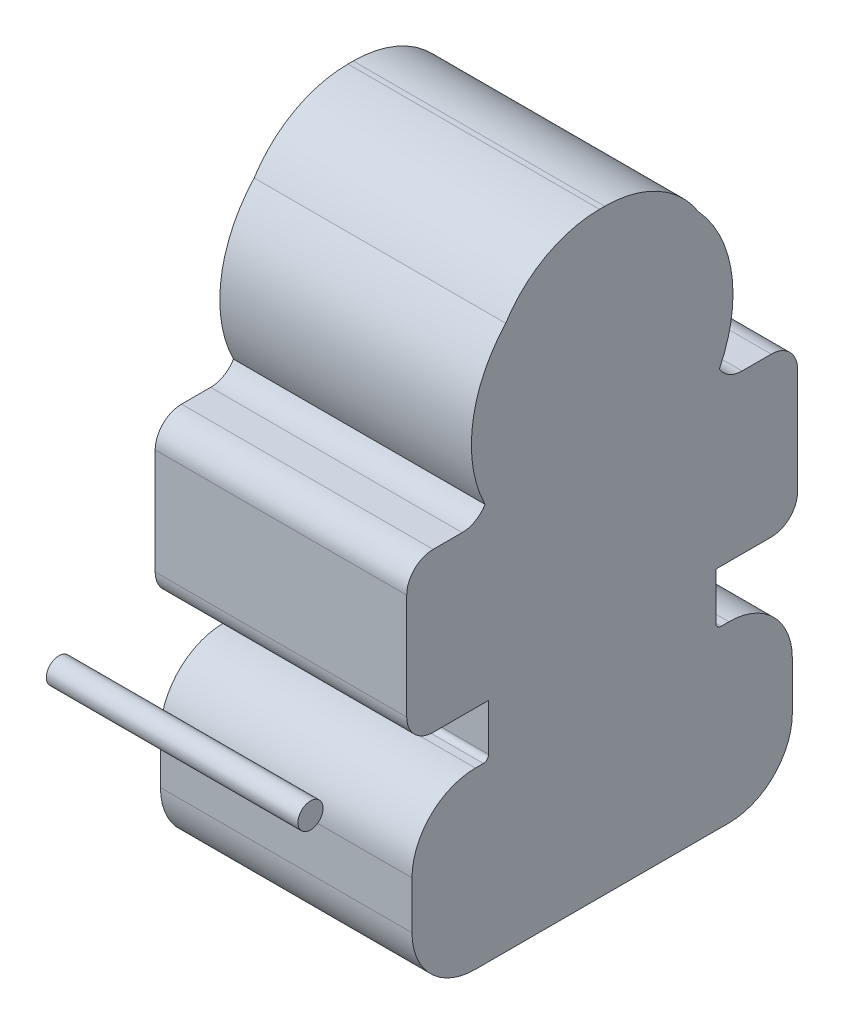
ISO-10303-21;
HEADER;
FILE_DESCRIPTION(('STEP AP214'),'2;1');
FILE_NAME('part.step','',(''),(''),'','','');
FILE_SCHEMA(('AUTOMOTIVE_DESIGN { 1 0 10303 214 1 1 1 1 }'));
ENDSEC;
DATA;
#1=APPLICATION_CONTEXT('core data for automotive mechanical design processes');
#2=APPLICATION_PROTOCOL_DEFINITION('international standard','automotive_design',2000,#1);
#3=PRODUCT_CONTEXT('',#1,'mechanical');
#4=PRODUCT('Part','Part','',(#3));
#5=PRODUCT_RELATED_PRODUCT_CATEGORY('part','',(#4));
#6=PRODUCT_DEFINITION_FORMATION('','',#4);
#7=PRODUCT_DEFINITION_CONTEXT('part definition',#1,'design');
#8=PRODUCT_DEFINITION('design','',#6,#7);
#9=PRODUCT_DEFINITION_SHAPE('','',#8);
#10=(LENGTH_UNIT() NAMED_UNIT(*) SI_UNIT(.MILLI.,.METRE.));
#11=(NAMED_UNIT(*) PLANE_ANGLE_UNIT() SI_UNIT($,.RADIAN.));
#12=(NAMED_UNIT(*) SI_UNIT($,.STERADIAN.) SOLID_ANGLE_UNIT());
#13=UNCERTAINTY_MEASURE_WITH_UNIT(LENGTH_MEASURE(1.E-05),#10,'distance_accuracy_value','');
#14=(GEOMETRIC_REPRESENTATION_CONTEXT(3) GLOBAL_UNCERTAINTY_ASSIGNED_CONTEXT((#13)) GLOBAL_UNIT_ASSIGNED_CONTEXT((#10,
#11,#12)) REPRESENTATION_CONTEXT('',''));
#15=CARTESIAN_POINT('',(0.,0.,0.));
#16=DIRECTION('',(0.,0.,1.));
#17=DIRECTION('',(1.,0.,0.));
#18=AXIS2_PLACEMENT_3D('',#15,#16,#17);
#19=CARTESIAN_POINT('',(52.,38.86,-85.805));
#20=DIRECTION('',(-1.,0.,0.));
#21=DIRECTION('',(0.,0.,1.));
#22=AXIS2_PLACEMENT_3D('',#19,#20,#21);
#23=CYLINDRICAL_SURFACE('',#22,5.24999999999999);
#24=CARTESIAN_POINT('',(2.,38.86,-85.805));
#25=DIRECTION('',(1.,0.,0.));
#26=DIRECTION('',(0.,0.,-1.));
#27=AXIS2_PLACEMENT_3D('',#24,#25,#26);
#28=CIRCLE('',#27,5.24999999999999);
#29=CARTESIAN_POINT('',(2.,36.2107520352715,-81.2724526785281));
#30=VERTEX_POINT('',#29);
#31=CARTESIAN_POINT('',(2.,33.61,-85.805));
#32=VERTEX_POINT('',#31);
#33=EDGE_CURVE('E12',#30,#32,#28,.T.);
#34=ORIENTED_EDGE('',*,*,#33,.F.);
#35=DIRECTION('',(-1.,0.,0.));
#36=VECTOR('',#35,1.);
#37=CARTESIAN_POINT('',(52.,36.2107520352715,-81.2724526785281));
#38=LINE('',#37,#36);
#39=CARTESIAN_POINT('',(52.,36.2107520352715,-81.2724526785281));
#40=VERTEX_POINT('',#39);
#41=EDGE_CURVE('E176',#40,#30,#38,.T.);
#42=ORIENTED_EDGE('',*,*,#41,.F.);
#43=CARTESIAN_POINT('',(52.,38.86,-85.805));
#44=DIRECTION('',(1.,0.,0.));
#45=DIRECTION('',(0.,0.,-1.));
#46=AXIS2_PLACEMENT_3D('',#43,#44,#45);
#47=CIRCLE('',#46,5.24999999999999);
#48=CARTESIAN_POINT('',(52.,33.61,-85.805));
#49=VERTEX_POINT('',#48);
#50=EDGE_CURVE('E53',#40,#49,#47,.T.);
#51=ORIENTED_EDGE('',*,*,#50,.T.);
#52=DIRECTION('',(-1.,0.,0.));
#53=VECTOR('',#52,1.);
#54=CARTESIAN_POINT('',(52.,33.61,-85.805));
#55=LINE('',#54,#53);
#56=EDGE_CURVE('E69',#49,#32,#55,.T.);
#57=ORIENTED_EDGE('',*,*,#56,.T.);
#58=EDGE_LOOP('',(#34,#42,#51,#57));
#59=FACE_BOUND('',#58,.T.);
#60=ADVANCED_FACE('F49',(#59),#23,.F.);
#61=CARTESIAN_POINT('',(52.,47.7633122804523,-57.98));
#62=DIRECTION('',(-1.,0.,0.));
#63=DIRECTION('',(0.,0.,1.));
#64=AXIS2_PLACEMENT_3D('',#61,#62,#63);
#65=CYLINDRICAL_SURFACE('',#64,26.);
#66=CARTESIAN_POINT('',(2.,47.7633122804523,-57.98));
#67=DIRECTION('',(1.,0.,0.));
#68=DIRECTION('',(0.,0.,-1.));
#69=AXIS2_PLACEMENT_3D('',#66,#67,#68);
#70=CIRCLE('',#69,26.);
#71=CARTESIAN_POINT('',(2.,65.3197595804659,-77.1573605640048));
#72=VERTEX_POINT('',#71);
#73=EDGE_CURVE('E374',#30,#72,#70,.T.);
#74=ORIENTED_EDGE('',*,*,#73,.T.);
#75=DIRECTION('',(-1.,0.,0.));
#76=VECTOR('',#75,1.);
#77=CARTESIAN_POINT('',(52.,65.3197595804659,-77.1573605640048));
#78=LINE('',#77,#76);
#79=CARTESIAN_POINT('',(52.,65.3197595804659,-77.1573605640048));
#80=VERTEX_POINT('',#79);
#81=EDGE_CURVE('E564',#80,#72,#78,.T.);
#82=ORIENTED_EDGE('',*,*,#81,.F.);
#83=CARTESIAN_POINT('',(52.,47.7633122804523,-57.98));
#84=DIRECTION('',(1.,0.,0.));
#85=DIRECTION('',(0.,0.,-1.));
#86=AXIS2_PLACEMENT_3D('',#83,#84,#85);
#87=CIRCLE('',#86,26.);
#88=EDGE_CURVE('E287',#40,#80,#87,.T.);
#89=ORIENTED_EDGE('',*,*,#88,.F.);
#90=ORIENTED_EDGE('',*,*,#41,.T.);
#91=EDGE_LOOP('',(#74,#82,#89,#90));
#92=FACE_BOUND('',#91,.T.);
#93=ADVANCED_FACE('F586',(#92),#65,.T.);
#94=CARTESIAN_POINT('',(52.,53.56,-58.505));
#95=DIRECTION('',(-1.,0.,0.));
#96=DIRECTION('',(0.,0.,1.));
#97=AXIS2_PLACEMENT_3D('',#94,#95,#96);
#98=CYLINDRICAL_SURFACE('',#97,22.05);
#99=CARTESIAN_POINT('',(2.,53.56,-58.505));
#100=DIRECTION('',(1.,0.,0.));
#101=DIRECTION('',(0.,0.,-1.));
#102=AXIS2_PLACEMENT_3D('',#99,#100,#101);
#103=CIRCLE('',#102,22.05);
#104=CARTESIAN_POINT('',(2.,75.61,-58.505));
#105=VERTEX_POINT('',#104);
#106=EDGE_CURVE('E376',#72,#105,#103,.T.);
#107=ORIENTED_EDGE('',*,*,#106,.T.);
#108=DIRECTION('',(-1.,0.,0.));
#109=VECTOR('',#108,1.);
#110=CARTESIAN_POINT('',(52.,75.61,-58.505));
#111=LINE('',#110,#109);
#112=CARTESIAN_POINT('',(52.,75.61,-58.505));
#113=VERTEX_POINT('',#112);
#114=EDGE_CURVE('E561',#113,#105,#111,.T.);
#115=ORIENTED_EDGE('',*,*,#114,.F.);
#116=CARTESIAN_POINT('',(52.,53.56,-58.505));
#117=DIRECTION('',(1.,0.,0.));
#118=DIRECTION('',(0.,0.,-1.));
#119=AXIS2_PLACEMENT_3D('',#116,#117,#118);
#120=CIRCLE('',#119,22.05);
#121=EDGE_CURVE('E290',#80,#113,#120,.T.);
#122=ORIENTED_EDGE('',*,*,#121,.F.);
#123=ORIENTED_EDGE('',*,*,#81,.T.);
#124=EDGE_LOOP('',(#107,#115,#122,#123));
#125=FACE_BOUND('',#124,.T.);
#126=ADVANCED_FACE('F570',(#125),#98,.T.);
#127=CARTESIAN_POINT('',(52.,75.61,-58.505));
#128=DIRECTION('',(0.,-1.,0.));
#129=DIRECTION('',(0.,0.,-1.));
#130=AXIS2_PLACEMENT_3D('',#127,#128,#129);
#131=PLANE('',#130);
#132=DIRECTION('',(0.,0.,1.));
#133=VECTOR('',#132,1.);
#134=CARTESIAN_POINT('',(2.,75.61,-58.505));
#135=LINE('',#134,#133);
#136=CARTESIAN_POINT('',(2.,75.61,-57.455));
#137=VERTEX_POINT('',#136);
#138=EDGE_CURVE('E381',#105,#137,#135,.T.);
#139=ORIENTED_EDGE('',*,*,#138,.T.);
#140=DIRECTION('',(-1.,0.,0.));
#141=VECTOR('',#140,1.);
#142=CARTESIAN_POINT('',(52.,75.61,-57.455));
#143=LINE('',#142,#141);
#144=CARTESIAN_POINT('',(52.,75.61,-57.455));
#145=VERTEX_POINT('',#144);
#146=EDGE_CURVE('E557',#145,#137,#143,.T.);
#147=ORIENTED_EDGE('',*,*,#146,.F.);
#148=DIRECTION('',(0.,0.,1.));
#149=VECTOR('',#148,1.);
#150=CARTESIAN_POINT('',(52.,75.61,-58.505));
#151=LINE('',#150,#149);
#152=EDGE_CURVE('E293',#113,#145,#151,.T.);
#153=ORIENTED_EDGE('',*,*,#152,.F.);
#154=ORIENTED_EDGE('',*,*,#114,.T.);
#155=EDGE_LOOP('',(#139,#147,#153,#154));
#156=FACE_BOUND('',#155,.T.);
#157=ADVANCED_FACE('F577',(#156),#131,.F.);
#158=CARTESIAN_POINT('',(52.,53.56,-57.455));
#159=DIRECTION('',(-1.,0.,0.));
#160=DIRECTION('',(0.,0.,1.));
#161=AXIS2_PLACEMENT_3D('',#158,#159,#160);
#162=CYLINDRICAL_SURFACE('',#161,22.05);
#163=CARTESIAN_POINT('',(2.,53.56,-57.455));
#164=DIRECTION('',(1.,0.,0.));
#165=DIRECTION('',(0.,0.,-1.));
#166=AXIS2_PLACEMENT_3D('',#163,#164,#165);
#167=CIRCLE('',#166,22.05);
#168=CARTESIAN_POINT('',(2.,65.3197595804658,-38.8026394359951));
#169=VERTEX_POINT('',#168);
#170=EDGE_CURVE('E388',#137,#169,#167,.T.);
#171=ORIENTED_EDGE('',*,*,#170,.T.);
#172=DIRECTION('',(-1.,0.,0.));
#173=VECTOR('',#172,1.);
#174=CARTESIAN_POINT('',(52.,65.3197595804658,-38.8026394359951));
#175=LINE('',#174,#173);
#176=CARTESIAN_POINT('',(52.,65.3197595804658,-38.8026394359951));
#177=VERTEX_POINT('',#176);
#178=EDGE_CURVE('E553',#177,#169,#175,.T.);
#179=ORIENTED_EDGE('',*,*,#178,.F.);
#180=CARTESIAN_POINT('',(52.,53.56,-57.455));
#181=DIRECTION('',(1.,0.,0.));
#182=DIRECTION('',(0.,0.,-1.));
#183=AXIS2_PLACEMENT_3D('',#180,#181,#182);
#184=CIRCLE('',#183,22.05);
#185=EDGE_CURVE('E296',#145,#177,#184,.T.);
#186=ORIENTED_EDGE('',*,*,#185,.F.);
#187=ORIENTED_EDGE('',*,*,#146,.T.);
#188=EDGE_LOOP('',(#171,#179,#186,#187));
#189=FACE_BOUND('',#188,.T.);
#190=ADVANCED_FACE('F581',(#189),#162,.T.);
#191=CARTESIAN_POINT('',(52.,47.7633122804523,-57.98));
#192=DIRECTION('',(-1.,0.,0.));
#193=DIRECTION('',(0.,0.,1.));
#194=AXIS2_PLACEMENT_3D('',#191,#192,#193);
#195=CYLINDRICAL_SURFACE('',#194,26.);
#196=CARTESIAN_POINT('',(2.,47.7633122804523,-57.98));
#197=DIRECTION('',(1.,0.,0.));
#198=DIRECTION('',(0.,0.,-1.));
#199=AXIS2_PLACEMENT_3D('',#196,#197,#198);
#200=CIRCLE('',#199,26.);
#201=CARTESIAN_POINT('',(2.,36.2107520352715,-34.6875473214719));
#202=VERTEX_POINT('',#201);
#203=EDGE_CURVE('E391',#169,#202,#200,.T.);
#204=ORIENTED_EDGE('',*,*,#203,.T.);
#205=DIRECTION('',(-1.,0.,0.));
#206=VECTOR('',#205,1.);
#207=CARTESIAN_POINT('',(52.,36.2107520352715,-34.6875473214719));
#208=LINE('',#207,#206);
#209=CARTESIAN_POINT('',(52.,36.2107520352715,-34.6875473214719));
#210=VERTEX_POINT('',#209);
#211=EDGE_CURVE('E550',#210,#202,#208,.T.);
#212=ORIENTED_EDGE('',*,*,#211,.F.);
#213=CARTESIAN_POINT('',(52.,47.7633122804523,-57.98));
#214=DIRECTION('',(1.,0.,0.));
#215=DIRECTION('',(0.,0.,-1.));
#216=AXIS2_PLACEMENT_3D('',#213,#214,#215);
#217=CIRCLE('',#216,26.);
#218=EDGE_CURVE('E299',#177,#210,#217,.T.);
#219=ORIENTED_EDGE('',*,*,#218,.F.);
#220=ORIENTED_EDGE('',*,*,#178,.T.);
#221=EDGE_LOOP('',(#204,#212,#219,#220));
#222=FACE_BOUND('',#221,.T.);
#223=ADVANCED_FACE('F691',(#222),#195,.T.);
#224=CARTESIAN_POINT('',(52.,38.86,-30.155));
#225=DIRECTION('',(-1.,0.,0.));
#226=DIRECTION('',(0.,0.,1.));
#227=AXIS2_PLACEMENT_3D('',#224,#225,#226);
#228=CYLINDRICAL_SURFACE('',#227,5.25000000000001);
#229=CARTESIAN_POINT('',(2.,38.86,-30.155));
#230=DIRECTION('',(1.,0.,0.));
#231=DIRECTION('',(0.,0.,-1.));
#232=AXIS2_PLACEMENT_3D('',#229,#230,#231);
#233=CIRCLE('',#232,5.25000000000001);
#234=CARTESIAN_POINT('',(2.,33.61,-30.155));
#235=VERTEX_POINT('',#234);
#236=EDGE_CURVE('E395',#235,#202,#233,.T.);
#237=ORIENTED_EDGE('',*,*,#236,.F.);
#238=DIRECTION('',(-1.,0.,0.));
#239=VECTOR('',#238,1.);
#240=CARTESIAN_POINT('',(52.,33.61,-30.155));
#241=LINE('',#240,#239);
#242=CARTESIAN_POINT('',(52.,33.61,-30.155));
#243=VERTEX_POINT('',#242);
#244=EDGE_CURVE('E547',#243,#235,#241,.T.);
#245=ORIENTED_EDGE('',*,*,#244,.F.);
#246=CARTESIAN_POINT('',(52.,38.86,-30.155));
#247=DIRECTION('',(1.,0.,0.));
#248=DIRECTION('',(0.,0.,-1.));
#249=AXIS2_PLACEMENT_3D('',#246,#247,#248);
#250=CIRCLE('',#249,5.25000000000001);
#251=EDGE_CURVE('E302',#243,#210,#250,.T.);
#252=ORIENTED_EDGE('',*,*,#251,.T.);
#253=ORIENTED_EDGE('',*,*,#211,.T.);
#254=EDGE_LOOP('',(#237,#245,#252,#253));
#255=FACE_BOUND('',#254,.T.);
#256=ADVANCED_FACE('F687',(#255),#228,.F.);
#257=CARTESIAN_POINT('',(52.,33.61,-30.155));
#258=DIRECTION('',(0.,-1.,0.));
#259=DIRECTION('',(0.,0.,-1.));
#260=AXIS2_PLACEMENT_3D('',#257,#258,#259);
#261=PLANE('',#260);
#262=DIRECTION('',(0.,0.,1.));
#263=VECTOR('',#262,1.);
#264=CARTESIAN_POINT('',(2.,33.61,-30.155));
#265=LINE('',#264,#263);
#266=CARTESIAN_POINT('',(2.,33.61,-24.38));
#267=VERTEX_POINT('',#266);
#268=EDGE_CURVE('E399',#235,#267,#265,.T.);
#269=ORIENTED_EDGE('',*,*,#268,.T.);
#270=DIRECTION('',(-1.,0.,0.));
#271=VECTOR('',#270,1.);
#272=CARTESIAN_POINT('',(52.,33.61,-24.38));
#273=LINE('',#272,#271);
#274=CARTESIAN_POINT('',(52.,33.61,-24.38));
#275=VERTEX_POINT('',#274);
#276=EDGE_CURVE('E543',#275,#267,#273,.T.);
#277=ORIENTED_EDGE('',*,*,#276,.F.);
#278=DIRECTION('',(0.,0.,1.));
#279=VECTOR('',#278,1.);
#280=CARTESIAN_POINT('',(52.,33.61,-30.155));
#281=LINE('',#280,#279);
#282=EDGE_CURVE('E306',#243,#275,#281,.T.);
#283=ORIENTED_EDGE('',*,*,#282,.F.);
#284=ORIENTED_EDGE('',*,*,#244,.T.);
#285=EDGE_LOOP('',(#269,#277,#283,#284));
#286=FACE_BOUND('',#285,.T.);
#287=ADVANCED_FACE('F683',(#286),#261,.F.);
#288=CARTESIAN_POINT('',(52.,28.36,-24.38));
#289=DIRECTION('',(-1.,0.,0.));
#290=DIRECTION('',(0.,0.,1.));
#291=AXIS2_PLACEMENT_3D('',#288,#289,#290);
#292=CYLINDRICAL_SURFACE('',#291,5.25);
#293=CARTESIAN_POINT('',(2.,28.36,-24.38));
#294=DIRECTION('',(1.,0.,0.));
#295=DIRECTION('',(0.,0.,-1.));
#296=AXIS2_PLACEMENT_3D('',#293,#294,#295);
#297=CIRCLE('',#296,5.25);
#298=CARTESIAN_POINT('',(2.,28.36,-19.13));
#299=VERTEX_POINT('',#298);
#300=EDGE_CURVE('E402',#267,#299,#297,.T.);
#301=ORIENTED_EDGE('',*,*,#300,.T.);
#302=DIRECTION('',(-1.,0.,0.));
#303=VECTOR('',#302,1.);
#304=CARTESIAN_POINT('',(52.,28.36,-19.13));
#305=LINE('',#304,#303);
#306=CARTESIAN_POINT('',(52.,28.36,-19.13));
#307=VERTEX_POINT('',#306);
#308=EDGE_CURVE('E539',#307,#299,#305,.T.);
#309=ORIENTED_EDGE('',*,*,#308,.F.);
#310=CARTESIAN_POINT('',(52.,28.36,-24.38));
#311=DIRECTION('',(1.,0.,0.));
#312=DIRECTION('',(0.,0.,-1.));
#313=AXIS2_PLACEMENT_3D('',#310,#311,#312);
#314=CIRCLE('',#313,5.25);
#315=EDGE_CURVE('E309',#275,#307,#314,.T.);
#316=ORIENTED_EDGE('',*,*,#315,.F.);
#317=ORIENTED_EDGE('',*,*,#276,.T.);
#318=EDGE_LOOP('',(#301,#309,#316,#317));
#319=FACE_BOUND('',#318,.T.);
#320=ADVANCED_FACE('F679',(#319),#292,.T.);
#321=CARTESIAN_POINT('',(52.,28.36,-19.13));
#322=DIRECTION('',(0.,0.,-1.));
#323=DIRECTION('',(0.,1.,0.));
#324=AXIS2_PLACEMENT_3D('',#321,#322,#323);
#325=PLANE('',#324);
#326=DIRECTION('',(0.,-1.,0.));
#327=VECTOR('',#326,1.);
#328=CARTESIAN_POINT('',(2.,28.36,-19.13));
#329=LINE('',#328,#327);
#330=CARTESIAN_POINT('',(2.,7.35999999999998,-19.13));
#331=VERTEX_POINT('',#330);
#332=EDGE_CURVE('E405',#299,#331,#329,.T.);
#333=ORIENTED_EDGE('',*,*,#332,.T.);
#334=DIRECTION('',(-1.,0.,0.));
#335=VECTOR('',#334,1.);
#336=CARTESIAN_POINT('',(52.,7.35999999999998,-19.13));
#337=LINE('',#336,#335);
#338=CARTESIAN_POINT('',(52.,7.35999999999998,-19.13));
#339=VERTEX_POINT('',#338);
#340=EDGE_CURVE('E535',#339,#331,#337,.T.);
#341=ORIENTED_EDGE('',*,*,#340,.F.);
#342=DIRECTION('',(0.,-1.,0.));
#343=VECTOR('',#342,1.);
#344=CARTESIAN_POINT('',(52.,28.36,-19.13));
#345=LINE('',#344,#343);
#346=EDGE_CURVE('E312',#307,#339,#345,.T.);
#347=ORIENTED_EDGE('',*,*,#346,.F.);
#348=ORIENTED_EDGE('',*,*,#308,.T.);
#349=EDGE_LOOP('',(#333,#341,#347,#348));
#350=FACE_BOUND('',#349,.T.);
#351=ADVANCED_FACE('F675',(#350),#325,.F.);
#352=CARTESIAN_POINT('',(52.,7.35999999999998,-24.38));
#353=DIRECTION('',(-1.,0.,0.));
#354=DIRECTION('',(0.,0.,1.));
#355=AXIS2_PLACEMENT_3D('',#352,#353,#354);
#356=CYLINDRICAL_SURFACE('',#355,5.25);
#357=CARTESIAN_POINT('',(2.,7.35999999999998,-24.38));
#358=DIRECTION('',(1.,0.,0.));
#359=DIRECTION('',(0.,0.,-1.));
#360=AXIS2_PLACEMENT_3D('',#357,#358,#359);
#361=CIRCLE('',#360,5.25);
#362=CARTESIAN_POINT('',(2.,2.10999999999998,-24.38));
#363=VERTEX_POINT('',#362);
#364=EDGE_CURVE('E408',#331,#363,#361,.T.);
#365=ORIENTED_EDGE('',*,*,#364,.T.);
#366=DIRECTION('',(-1.,0.,0.));
#367=VECTOR('',#366,1.);
#368=CARTESIAN_POINT('',(52.,2.10999999999998,-24.38));
#369=LINE('',#368,#367);
#370=CARTESIAN_POINT('',(52.,2.10999999999998,-24.38));
#371=VERTEX_POINT('',#370);
#372=EDGE_CURVE('E531',#371,#363,#369,.T.);
#373=ORIENTED_EDGE('',*,*,#372,.F.);
#374=CARTESIAN_POINT('',(52.,7.35999999999998,-24.38));
#375=DIRECTION('',(1.,0.,0.));
#376=DIRECTION('',(0.,0.,-1.));
#377=AXIS2_PLACEMENT_3D('',#374,#375,#376);
#378=CIRCLE('',#377,5.25);
#379=EDGE_CURVE('E315',#339,#371,#378,.T.);
#380=ORIENTED_EDGE('',*,*,#379,.F.);
#381=ORIENTED_EDGE('',*,*,#340,.T.);
#382=EDGE_LOOP('',(#365,#373,#380,#381));
#383=FACE_BOUND('',#382,.T.);
#384=ADVANCED_FACE('F671',(#383),#356,.T.);
#385=CARTESIAN_POINT('',(52.,2.10999999999998,-24.38));
#386=DIRECTION('',(0.,1.,0.));
#387=DIRECTION('',(0.,0.,1.));
#388=AXIS2_PLACEMENT_3D('',#385,#386,#387);
#389=PLANE('',#388);
#390=DIRECTION('',(0.,0.,-1.));
#391=VECTOR('',#390,1.);
#392=CARTESIAN_POINT('',(2.,2.10999999999998,-24.38));
#393=LINE('',#392,#391);
#394=CARTESIAN_POINT('',(2.,2.11,-35.405));
#395=VERTEX_POINT('',#394);
#396=EDGE_CURVE('E411',#363,#395,#393,.T.);
#397=ORIENTED_EDGE('',*,*,#396,.T.);
#398=DIRECTION('',(-1.,0.,0.));
#399=VECTOR('',#398,1.);
#400=CARTESIAN_POINT('',(52.,2.11,-35.405));
#401=LINE('',#400,#399);
#402=CARTESIAN_POINT('',(52.,2.11,-35.405));
#403=VERTEX_POINT('',#402);
#404=EDGE_CURVE('E527',#403,#395,#401,.T.);
#405=ORIENTED_EDGE('',*,*,#404,.F.);
#406=DIRECTION('',(0.,0.,-1.));
#407=VECTOR('',#406,1.);
#408=CARTESIAN_POINT('',(52.,2.10999999999998,-24.38));
#409=LINE('',#408,#407);
#410=EDGE_CURVE('E318',#371,#403,#409,.T.);
#411=ORIENTED_EDGE('',*,*,#410,.F.);
#412=ORIENTED_EDGE('',*,*,#372,.T.);
#413=EDGE_LOOP('',(#397,#405,#411,#412));
#414=FACE_BOUND('',#413,.T.);
#415=ADVANCED_FACE('F667',(#414),#389,.F.);
#416=CARTESIAN_POINT('',(52.,2.11,-35.405));
#417=DIRECTION('',(0.,0.,-1.));
#418=DIRECTION('',(-1.,0.,0.));
#419=AXIS2_PLACEMENT_3D('',#416,#417,#418);
#420=PLANE('',#419);
#421=DIRECTION('',(0.,-1.,0.));
#422=VECTOR('',#421,1.);
#423=CARTESIAN_POINT('',(2.,2.11,-35.405));
#424=LINE('',#423,#422);
#425=CARTESIAN_POINT('',(2.,-7.19000000000002,-35.405));
#426=VERTEX_POINT('',#425);
#427=EDGE_CURVE('E414',#395,#426,#424,.T.);
#428=ORIENTED_EDGE('',*,*,#427,.T.);
#429=DIRECTION('',(-1.,0.,0.));
#430=VECTOR('',#429,1.);
#431=CARTESIAN_POINT('',(52.,-7.19000000000002,-35.405));
#432=LINE('',#431,#430);
#433=CARTESIAN_POINT('',(52.,-7.19000000000002,-35.405));
#434=VERTEX_POINT('',#433);
#435=EDGE_CURVE('E524',#434,#426,#432,.T.);
#436=ORIENTED_EDGE('',*,*,#435,.F.);
#437=DIRECTION('',(0.,-1.,0.));
#438=VECTOR('',#437,1.);
#439=CARTESIAN_POINT('',(52.,2.11,-35.405));
#440=LINE('',#439,#438);
#441=EDGE_CURVE('E321',#403,#434,#440,.T.);
#442=ORIENTED_EDGE('',*,*,#441,.F.);
#443=ORIENTED_EDGE('',*,*,#404,.T.);
#444=EDGE_LOOP('',(#428,#436,#442,#443));
#445=FACE_BOUND('',#444,.T.);
#446=ADVANCED_FACE('F663',(#445),#420,.F.);
#447=CARTESIAN_POINT('',(52.,-7.19000000000003,-34.355));
#448=DIRECTION('',(-1.,0.,0.));
#449=DIRECTION('',(0.,0.,1.));
#450=AXIS2_PLACEMENT_3D('',#447,#448,#449);
#451=CYLINDRICAL_SURFACE('',#450,1.05);
#452=CARTESIAN_POINT('',(2.,-7.19000000000003,-34.355));
#453=DIRECTION('',(1.,0.,0.));
#454=DIRECTION('',(0.,0.,-1.));
#455=AXIS2_PLACEMENT_3D('',#452,#453,#454);
#456=CIRCLE('',#455,1.05);
#457=CARTESIAN_POINT('',(2.,-8.24000000000003,-34.355));
#458=VERTEX_POINT('',#457);
#459=EDGE_CURVE('E418',#458,#426,#456,.T.);
#460=ORIENTED_EDGE('',*,*,#459,.F.);
#461=DIRECTION('',(-1.,0.,0.));
#462=VECTOR('',#461,1.);
#463=CARTESIAN_POINT('',(52.,-8.24000000000003,-34.355));
#464=LINE('',#463,#462);
#465=CARTESIAN_POINT('',(52.,-8.24000000000003,-34.355));
#466=VERTEX_POINT('',#465);
#467=EDGE_CURVE('E521',#466,#458,#464,.T.);
#468=ORIENTED_EDGE('',*,*,#467,.F.);
#469=CARTESIAN_POINT('',(52.,-7.19000000000003,-34.355));
#470=DIRECTION('',(1.,0.,0.));
#471=DIRECTION('',(0.,0.,-1.));
#472=AXIS2_PLACEMENT_3D('',#469,#470,#471);
#473=CIRCLE('',#472,1.05);
#474=EDGE_CURVE('E324',#466,#434,#473,.T.);
#475=ORIENTED_EDGE('',*,*,#474,.T.);
#476=ORIENTED_EDGE('',*,*,#435,.T.);
#477=EDGE_LOOP('',(#460,#468,#475,#476));
#478=FACE_BOUND('',#477,.T.);
#479=ADVANCED_FACE('F659',(#478),#451,.F.);
#480=CARTESIAN_POINT('',(52.,-8.24000000000003,-34.355));
#481=DIRECTION('',(0.,-1.,0.));
#482=DIRECTION('',(0.,0.,-1.));
#483=AXIS2_PLACEMENT_3D('',#480,#481,#482);
#484=PLANE('',#483);
#485=DIRECTION('',(0.,0.,1.));
#486=VECTOR('',#485,1.);
#487=CARTESIAN_POINT('',(2.,-8.24000000000003,-34.355));
#488=LINE('',#487,#486);
#489=CARTESIAN_POINT('',(2.,-8.24000000000004,-32.78));
#490=VERTEX_POINT('',#489);
#491=EDGE_CURVE('E422',#458,#490,#488,.T.);
#492=ORIENTED_EDGE('',*,*,#491,.T.);
#493=DIRECTION('',(-1.,0.,0.));
#494=VECTOR('',#493,1.);
#495=CARTESIAN_POINT('',(52.,-8.24000000000004,-32.78));
#496=LINE('',#495,#494);
#497=CARTESIAN_POINT('',(52.,-8.24000000000004,-32.78));
#498=VERTEX_POINT('',#497);
#499=EDGE_CURVE('E517',#498,#490,#496,.T.);
#500=ORIENTED_EDGE('',*,*,#499,.F.);
#501=DIRECTION('',(0.,0.,1.));
#502=VECTOR('',#501,1.);
#503=CARTESIAN_POINT('',(52.,-8.24000000000003,-34.355));
#504=LINE('',#503,#502);
#505=EDGE_CURVE('E328',#466,#498,#504,.T.);
#506=ORIENTED_EDGE('',*,*,#505,.F.);
#507=ORIENTED_EDGE('',*,*,#467,.T.);
#508=EDGE_LOOP('',(#492,#500,#506,#507));
#509=FACE_BOUND('',#508,.T.);
#510=ADVANCED_FACE('F655',(#509),#484,.F.);
#511=CARTESIAN_POINT('',(52.,-20.84,-32.78));
#512=DIRECTION('',(-1.,0.,0.));
#513=DIRECTION('',(0.,0.,1.));
#514=AXIS2_PLACEMENT_3D('',#511,#512,#513);
#515=CYLINDRICAL_SURFACE('',#514,12.6);
#516=CARTESIAN_POINT('',(2.,-20.84,-32.78));
#517=DIRECTION('',(1.,0.,0.));
#518=DIRECTION('',(0.,0.,-1.));
#519=AXIS2_PLACEMENT_3D('',#516,#517,#518);
#520=CIRCLE('',#519,12.6);
#521=CARTESIAN_POINT('',(2.,-20.84,-20.18));
#522=VERTEX_POINT('',#521);
#523=EDGE_CURVE('E425',#490,#522,#520,.T.);
#524=ORIENTED_EDGE('',*,*,#523,.T.);
#525=DIRECTION('',(-1.,0.,0.));
#526=VECTOR('',#525,1.);
#527=CARTESIAN_POINT('',(52.,-20.84,-20.18));
#528=LINE('',#527,#526);
#529=CARTESIAN_POINT('',(52.,-20.84,-20.18));
#530=VERTEX_POINT('',#529);
#531=EDGE_CURVE('E513',#530,#522,#528,.T.);
#532=ORIENTED_EDGE('',*,*,#531,.F.);
#533=CARTESIAN_POINT('',(52.,-20.84,-32.78));
#534=DIRECTION('',(1.,0.,0.));
#535=DIRECTION('',(0.,0.,-1.));
#536=AXIS2_PLACEMENT_3D('',#533,#534,#535);
#537=CIRCLE('',#536,12.6);
#538=EDGE_CURVE('E331',#498,#530,#537,.T.);
#539=ORIENTED_EDGE('',*,*,#538,.F.);
#540=ORIENTED_EDGE('',*,*,#499,.T.);
#541=EDGE_LOOP('',(#524,#532,#539,#540));
#542=FACE_BOUND('',#541,.T.);
#543=ADVANCED_FACE('F651',(#542),#515,.T.);
#544=CARTESIAN_POINT('',(52.,-20.84,-20.18));
#545=DIRECTION('',(0.,0.,-1.));
#546=DIRECTION('',(0.,1.,0.));
#547=AXIS2_PLACEMENT_3D('',#544,#545,#546);
#548=PLANE('',#547);
#549=DIRECTION('',(0.,-1.,0.));
#550=VECTOR('',#549,1.);
#551=CARTESIAN_POINT('',(2.,-20.84,-20.18));
#552=LINE('',#551,#550);
#553=CARTESIAN_POINT('',(2.,-30.29,-20.18));
#554=VERTEX_POINT('',#553);
#555=EDGE_CURVE('E428',#522,#554,#552,.T.);
#556=ORIENTED_EDGE('',*,*,#555,.T.);
#557=DIRECTION('',(-1.,0.,0.));
#558=VECTOR('',#557,1.);
#559=CARTESIAN_POINT('',(52.,-30.29,-20.18));
#560=LINE('',#559,#558);
#561=CARTESIAN_POINT('',(52.,-30.29,-20.18));
#562=VERTEX_POINT('',#561);
#563=EDGE_CURVE('E509',#562,#554,#560,.T.);
#564=ORIENTED_EDGE('',*,*,#563,.F.);
#565=DIRECTION('',(0.,-1.,0.));
#566=VECTOR('',#565,1.);
#567=CARTESIAN_POINT('',(52.,-20.84,-20.18));
#568=LINE('',#567,#566);
#569=EDGE_CURVE('E334',#530,#562,#568,.T.);
#570=ORIENTED_EDGE('',*,*,#569,.F.);
#571=ORIENTED_EDGE('',*,*,#531,.T.);
#572=EDGE_LOOP('',(#556,#564,#570,#571));
#573=FACE_BOUND('',#572,.T.);
#574=ADVANCED_FACE('F647',(#573),#548,.F.);
#575=CARTESIAN_POINT('',(52.,-30.29,-32.78));
#576=DIRECTION('',(-1.,0.,0.));
#577=DIRECTION('',(0.,0.,1.));
#578=AXIS2_PLACEMENT_3D('',#575,#576,#577);
#579=CYLINDRICAL_SURFACE('',#578,12.6);
#580=CARTESIAN_POINT('',(2.,-30.29,-32.78));
#581=DIRECTION('',(1.,0.,0.));
#582=DIRECTION('',(0.,0.,-1.));
#583=AXIS2_PLACEMENT_3D('',#580,#581,#582);
#584=CIRCLE('',#583,12.6);
#585=CARTESIAN_POINT('',(2.,-42.89,-32.78));
#586=VERTEX_POINT('',#585);
#587=EDGE_CURVE('E431',#554,#586,#584,.T.);
#588=ORIENTED_EDGE('',*,*,#587,.T.);
#589=DIRECTION('',(-1.,0.,0.));
#590=VECTOR('',#589,1.);
#591=CARTESIAN_POINT('',(52.,-42.89,-32.78));
#592=LINE('',#591,#590);
#593=CARTESIAN_POINT('',(52.,-42.89,-32.78));
#594=VERTEX_POINT('',#593);
#595=EDGE_CURVE('E505',#594,#586,#592,.T.);
#596=ORIENTED_EDGE('',*,*,#595,.F.);
#597=CARTESIAN_POINT('',(52.,-30.29,-32.78));
#598=DIRECTION('',(1.,0.,0.));
#599=DIRECTION('',(0.,0.,-1.));
#600=AXIS2_PLACEMENT_3D('',#597,#598,#599);
#601=CIRCLE('',#600,12.6);
#602=EDGE_CURVE('E337',#562,#594,#601,.T.);
#603=ORIENTED_EDGE('',*,*,#602,.F.);
#604=ORIENTED_EDGE('',*,*,#563,.T.);
#605=EDGE_LOOP('',(#588,#596,#603,#604));
#606=FACE_BOUND('',#605,.T.);
#607=ADVANCED_FACE('F643',(#606),#579,.T.);
#608=CARTESIAN_POINT('',(52.,-42.89,-32.78));
#609=DIRECTION('',(0.,1.,0.));
#610=DIRECTION('',(0.,0.,1.));
#611=AXIS2_PLACEMENT_3D('',#608,#609,#610);
#612=PLANE('',#611);
#613=DIRECTION('',(0.,0.,-1.));
#614=VECTOR('',#613,1.);
#615=CARTESIAN_POINT('',(2.,-42.89,-32.78));
#616=LINE('',#615,#614);
#617=CARTESIAN_POINT('',(2.,-42.89,-83.18));
#618=VERTEX_POINT('',#617);
#619=EDGE_CURVE('E434',#586,#618,#616,.T.);
#620=ORIENTED_EDGE('',*,*,#619,.T.);
#621=DIRECTION('',(-1.,0.,0.));
#622=VECTOR('',#621,1.);
#623=CARTESIAN_POINT('',(52.,-42.89,-83.18));
#624=LINE('',#623,#622);
#625=CARTESIAN_POINT('',(52.,-42.89,-83.18));
#626=VERTEX_POINT('',#625);
#627=EDGE_CURVE('E501',#626,#618,#624,.T.);
#628=ORIENTED_EDGE('',*,*,#627,.F.);
#629=DIRECTION('',(0.,0.,-1.));
#630=VECTOR('',#629,1.);
#631=CARTESIAN_POINT('',(52.,-42.89,-32.78));
#632=LINE('',#631,#630);
#633=EDGE_CURVE('E340',#594,#626,#632,.T.);
#634=ORIENTED_EDGE('',*,*,#633,.F.);
#635=ORIENTED_EDGE('',*,*,#595,.T.);
#636=EDGE_LOOP('',(#620,#628,#634,#635));
#637=FACE_BOUND('',#636,.T.);
#638=ADVANCED_FACE('F639',(#637),#612,.F.);
#639=CARTESIAN_POINT('',(52.,-30.29,-83.18));
#640=DIRECTION('',(-1.,0.,0.));
#641=DIRECTION('',(0.,0.,1.));
#642=AXIS2_PLACEMENT_3D('',#639,#640,#641);
#643=CYLINDRICAL_SURFACE('',#642,12.6);
#644=CARTESIAN_POINT('',(2.,-30.29,-83.18));
#645=DIRECTION('',(1.,0.,0.));
#646=DIRECTION('',(0.,0.,-1.));
#647=AXIS2_PLACEMENT_3D('',#644,#645,#646);
#648=CIRCLE('',#647,12.6);
#649=CARTESIAN_POINT('',(2.,-30.29,-95.78));
#650=VERTEX_POINT('',#649);
#651=EDGE_CURVE('E437',#618,#650,#648,.T.);
#652=ORIENTED_EDGE('',*,*,#651,.T.);
#653=DIRECTION('',(-1.,0.,0.));
#654=VECTOR('',#653,1.);
#655=CARTESIAN_POINT('',(52.,-30.29,-95.78));
#656=LINE('',#655,#654);
#657=CARTESIAN_POINT('',(52.,-30.29,-95.78));
#658=VERTEX_POINT('',#657);
#659=EDGE_CURVE('E497',#658,#650,#656,.T.);
#660=ORIENTED_EDGE('',*,*,#659,.F.);
#661=CARTESIAN_POINT('',(52.,-30.29,-83.18));
#662=DIRECTION('',(1.,0.,0.));
#663=DIRECTION('',(0.,0.,-1.));
#664=AXIS2_PLACEMENT_3D('',#661,#662,#663);
#665=CIRCLE('',#664,12.6);
#666=EDGE_CURVE('E343',#626,#658,#665,.T.);
#667=ORIENTED_EDGE('',*,*,#666,.F.);
#668=ORIENTED_EDGE('',*,*,#627,.T.);
#669=EDGE_LOOP('',(#652,#660,#667,#668));
#670=FACE_BOUND('',#669,.T.);
#671=ADVANCED_FACE('F635',(#670),#643,.T.);
#672=CARTESIAN_POINT('',(52.,-30.29,-95.78));
#673=DIRECTION('',(0.,0.,1.));
#674=DIRECTION('',(0.,-1.,0.));
#675=AXIS2_PLACEMENT_3D('',#672,#673,#674);
#676=PLANE('',#675);
#677=DIRECTION('',(0.,1.,0.));
#678=VECTOR('',#677,1.);
#679=CARTESIAN_POINT('',(2.,-30.29,-95.78));
#680=LINE('',#679,#678);
#681=CARTESIAN_POINT('',(2.,-20.84,-95.78));
#682=VERTEX_POINT('',#681);
#683=EDGE_CURVE('E440',#650,#682,#680,.T.);
#684=ORIENTED_EDGE('',*,*,#683,.T.);
#685=DIRECTION('',(-1.,0.,0.));
#686=VECTOR('',#685,1.);
#687=CARTESIAN_POINT('',(52.,-20.84,-95.78));
#688=LINE('',#687,#686);
#689=CARTESIAN_POINT('',(52.,-20.84,-95.78));
#690=VERTEX_POINT('',#689);
#691=EDGE_CURVE('E493',#690,#682,#688,.T.);
#692=ORIENTED_EDGE('',*,*,#691,.F.);
#693=DIRECTION('',(0.,1.,0.));
#694=VECTOR('',#693,1.);
#695=CARTESIAN_POINT('',(52.,-30.29,-95.78));
#696=LINE('',#695,#694);
#697=EDGE_CURVE('E346',#658,#690,#696,.T.);
#698=ORIENTED_EDGE('',*,*,#697,.F.);
#699=ORIENTED_EDGE('',*,*,#659,.T.);
#700=EDGE_LOOP('',(#684,#692,#698,#699));
#701=FACE_BOUND('',#700,.T.);
#702=ADVANCED_FACE('F631',(#701),#676,.F.);
#703=CARTESIAN_POINT('',(52.,-20.84,-83.18));
#704=DIRECTION('',(-1.,0.,0.));
#705=DIRECTION('',(0.,0.,1.));
#706=AXIS2_PLACEMENT_3D('',#703,#704,#705);
#707=CYLINDRICAL_SURFACE('',#706,12.6);
#708=CARTESIAN_POINT('',(2.,-20.84,-83.18));
#709=DIRECTION('',(1.,0.,0.));
#710=DIRECTION('',(0.,0.,-1.));
#711=AXIS2_PLACEMENT_3D('',#708,#709,#710);
#712=CIRCLE('',#711,12.6);
#713=CARTESIAN_POINT('',(2.,-8.24000000000001,-83.18));
#714=VERTEX_POINT('',#713);
#715=EDGE_CURVE('E443',#682,#714,#712,.T.);
#716=ORIENTED_EDGE('',*,*,#715,.T.);
#717=DIRECTION('',(-1.,0.,0.));
#718=VECTOR('',#717,1.);
#719=CARTESIAN_POINT('',(52.,-8.24000000000001,-83.18));
#720=LINE('',#719,#718);
#721=CARTESIAN_POINT('',(52.,-8.24000000000001,-83.18));
#722=VERTEX_POINT('',#721);
#723=EDGE_CURVE('E489',#722,#714,#720,.T.);
#724=ORIENTED_EDGE('',*,*,#723,.F.);
#725=CARTESIAN_POINT('',(52.,-20.84,-83.18));
#726=DIRECTION('',(1.,0.,0.));
#727=DIRECTION('',(0.,0.,-1.));
#728=AXIS2_PLACEMENT_3D('',#725,#726,#727);
#729=CIRCLE('',#728,12.6);
#730=EDGE_CURVE('E349',#690,#722,#729,.T.);
#731=ORIENTED_EDGE('',*,*,#730,.F.);
#732=ORIENTED_EDGE('',*,*,#691,.T.);
#733=EDGE_LOOP('',(#716,#724,#731,#732));
#734=FACE_BOUND('',#733,.T.);
#735=ADVANCED_FACE('F627',(#734),#707,.T.);
#736=CARTESIAN_POINT('',(52.,-8.24000000000001,-83.18));
#737=DIRECTION('',(0.,-1.,0.));
#738=DIRECTION('',(0.,0.,-1.));
#739=AXIS2_PLACEMENT_3D('',#736,#737,#738);
#740=PLANE('',#739);
#741=DIRECTION('',(0.,0.,1.));
#742=VECTOR('',#741,1.);
#743=CARTESIAN_POINT('',(2.,-8.24000000000001,-83.18));
#744=LINE('',#743,#742);
#745=CARTESIAN_POINT('',(2.,-8.24,-81.605));
#746=VERTEX_POINT('',#745);
#747=EDGE_CURVE('E446',#714,#746,#744,.T.);
#748=ORIENTED_EDGE('',*,*,#747,.T.);
#749=DIRECTION('',(-1.,0.,0.));
#750=VECTOR('',#749,1.);
#751=CARTESIAN_POINT('',(52.,-8.24,-81.605));
#752=LINE('',#751,#750);
#753=CARTESIAN_POINT('',(52.,-8.24,-81.605));
#754=VERTEX_POINT('',#753);
#755=EDGE_CURVE('E483',#754,#746,#752,.T.);
#756=ORIENTED_EDGE('',*,*,#755,.F.);
#757=DIRECTION('',(0.,0.,1.));
#758=VECTOR('',#757,1.);
#759=CARTESIAN_POINT('',(52.,-8.24000000000001,-83.18));
#760=LINE('',#759,#758);
#761=EDGE_CURVE('E352',#722,#754,#760,.T.);
#762=ORIENTED_EDGE('',*,*,#761,.F.);
#763=ORIENTED_EDGE('',*,*,#723,.T.);
#764=EDGE_LOOP('',(#748,#756,#762,#763));
#765=FACE_BOUND('',#764,.T.);
#766=ADVANCED_FACE('F623',(#765),#740,.F.);
#767=CARTESIAN_POINT('',(52.,-7.19,-81.605));
#768=DIRECTION('',(-1.,0.,0.));
#769=DIRECTION('',(0.,0.,1.));
#770=AXIS2_PLACEMENT_3D('',#767,#768,#769);
#771=CYLINDRICAL_SURFACE('',#770,1.05);
#772=CARTESIAN_POINT('',(2.,-7.19,-81.605));
#773=DIRECTION('',(1.,0.,0.));
#774=DIRECTION('',(0.,0.,-1.));
#775=AXIS2_PLACEMENT_3D('',#772,#773,#774);
#776=CIRCLE('',#775,1.05);
#777=CARTESIAN_POINT('',(2.,-7.19,-80.555));
#778=VERTEX_POINT('',#777);
#779=EDGE_CURVE('E450',#778,#746,#776,.T.);
#780=ORIENTED_EDGE('',*,*,#779,.F.);
#781=DIRECTION('',(-1.,0.,0.));
#782=VECTOR('',#781,1.);
#783=CARTESIAN_POINT('',(52.,-7.19,-80.555));
#784=LINE('',#783,#782);
#785=CARTESIAN_POINT('',(52.,-7.19,-80.555));
#786=VERTEX_POINT('',#785);
#787=EDGE_CURVE('E478',#786,#778,#784,.T.);
#788=ORIENTED_EDGE('',*,*,#787,.F.);
#789=CARTESIAN_POINT('',(52.,-7.19,-81.605));
#790=DIRECTION('',(1.,0.,0.));
#791=DIRECTION('',(0.,0.,-1.));
#792=AXIS2_PLACEMENT_3D('',#789,#790,#791);
#793=CIRCLE('',#792,1.05);
#794=EDGE_CURVE('E355',#786,#754,#793,.T.);
#795=ORIENTED_EDGE('',*,*,#794,.T.);
#796=ORIENTED_EDGE('',*,*,#755,.T.);
#797=EDGE_LOOP('',(#780,#788,#795,#796));
#798=FACE_BOUND('',#797,.T.);
#799=ADVANCED_FACE('F620',(#798),#771,.F.);
#800=CARTESIAN_POINT('',(52.,-7.19,-80.555));
#801=DIRECTION('',(0.,0.,1.));
#802=DIRECTION('',(0.,-1.,0.));
#803=AXIS2_PLACEMENT_3D('',#800,#801,#802);
#804=PLANE('',#803);
#805=DIRECTION('',(0.,1.,0.));
#806=VECTOR('',#805,1.);
#807=CARTESIAN_POINT('',(2.,-7.19,-80.555));
#808=LINE('',#807,#806);
#809=CARTESIAN_POINT('',(2.,2.11,-80.555));
#810=VERTEX_POINT('',#809);
#811=EDGE_CURVE('E454',#778,#810,#808,.T.);
#812=ORIENTED_EDGE('',*,*,#811,.T.);
#813=DIRECTION('',(-1.,0.,0.));
#814=VECTOR('',#813,1.);
#815=CARTESIAN_POINT('',(52.,2.11,-80.555));
#816=LINE('',#815,#814);
#817=CARTESIAN_POINT('',(52.,2.11,-80.555));
#818=VERTEX_POINT('',#817);
#819=EDGE_CURVE('E474',#818,#810,#816,.T.);
#820=ORIENTED_EDGE('',*,*,#819,.F.);
#821=DIRECTION('',(0.,1.,0.));
#822=VECTOR('',#821,1.);
#823=CARTESIAN_POINT('',(52.,-7.19,-80.555));
#824=LINE('',#823,#822);
#825=EDGE_CURVE('E359',#786,#818,#824,.T.);
#826=ORIENTED_EDGE('',*,*,#825,.F.);
#827=ORIENTED_EDGE('',*,*,#787,.T.);
#828=EDGE_LOOP('',(#812,#820,#826,#827));
#829=FACE_BOUND('',#828,.T.);
#830=ADVANCED_FACE('F617',(#829),#804,.F.);
#831=CARTESIAN_POINT('',(52.,2.11,-80.555));
#832=DIRECTION('',(0.,1.,0.));
#833=DIRECTION('',(0.,0.,1.));
#834=AXIS2_PLACEMENT_3D('',#831,#832,#833);
#835=PLANE('',#834);
#836=DIRECTION('',(0.,0.,-1.));
#837=VECTOR('',#836,1.);
#838=CARTESIAN_POINT('',(2.,2.11,-80.555));
#839=LINE('',#838,#837);
#840=CARTESIAN_POINT('',(2.,2.11,-91.58));
#841=VERTEX_POINT('',#840);
#842=EDGE_CURVE('E457',#810,#841,#839,.T.);
#843=ORIENTED_EDGE('',*,*,#842,.T.);
#844=DIRECTION('',(-1.,0.,0.));
#845=VECTOR('',#844,1.);
#846=CARTESIAN_POINT('',(52.,2.11,-91.58));
#847=LINE('',#846,#845);
#848=CARTESIAN_POINT('',(52.,2.11,-91.58));
#849=VERTEX_POINT('',#848);
#850=EDGE_CURVE('E465',#849,#841,#847,.T.);
#851=ORIENTED_EDGE('',*,*,#850,.F.);
#852=DIRECTION('',(0.,0.,-1.));
#853=VECTOR('',#852,1.);
#854=CARTESIAN_POINT('',(52.,2.11,-80.555));
#855=LINE('',#854,#853);
#856=EDGE_CURVE('E362',#818,#849,#855,.T.);
#857=ORIENTED_EDGE('',*,*,#856,.F.);
#858=ORIENTED_EDGE('',*,*,#819,.T.);
#859=EDGE_LOOP('',(#843,#851,#857,#858));
#860=FACE_BOUND('',#859,.T.);
#861=ADVANCED_FACE('F471',(#860),#835,.F.);
#862=CARTESIAN_POINT('',(52.,7.35999999999999,-91.58));
#863=DIRECTION('',(-1.,0.,0.));
#864=DIRECTION('',(0.,0.,1.));
#865=AXIS2_PLACEMENT_3D('',#862,#863,#864);
#866=CYLINDRICAL_SURFACE('',#865,5.25);
#867=CARTESIAN_POINT('',(2.,7.35999999999999,-91.58));
#868=DIRECTION('',(1.,0.,0.));
#869=DIRECTION('',(0.,0.,-1.));
#870=AXIS2_PLACEMENT_3D('',#867,#868,#869);
#871=CIRCLE('',#870,5.25);
#872=CARTESIAN_POINT('',(2.,7.35999999999999,-96.83));
#873=VERTEX_POINT('',#872);
#874=EDGE_CURVE('E271',#841,#873,#871,.T.);
#875=ORIENTED_EDGE('',*,*,#874,.T.);
#876=DIRECTION('',(-1.,0.,0.));
#877=VECTOR('',#876,1.);
#878=CARTESIAN_POINT('',(52.,7.35999999999999,-96.83));
#879=LINE('',#878,#877);
#880=CARTESIAN_POINT('',(52.,7.35999999999999,-96.83));
#881=VERTEX_POINT('',#880);
#882=EDGE_CURVE('E265',#881,#873,#879,.T.);
#883=ORIENTED_EDGE('',*,*,#882,.F.);
#884=CARTESIAN_POINT('',(52.,7.35999999999999,-91.58));
#885=DIRECTION('',(1.,0.,0.));
#886=DIRECTION('',(0.,0.,-1.));
#887=AXIS2_PLACEMENT_3D('',#884,#885,#886);
#888=CIRCLE('',#887,5.25);
#889=EDGE_CURVE('E365',#849,#881,#888,.T.);
#890=ORIENTED_EDGE('',*,*,#889,.F.);
#891=ORIENTED_EDGE('',*,*,#850,.T.);
#892=EDGE_LOOP('',(#875,#883,#890,#891));
#893=FACE_BOUND('',#892,.T.);
#894=ADVANCED_FACE('F462',(#893),#866,.T.);
#895=CARTESIAN_POINT('',(52.,7.35999999999999,-96.83));
#896=DIRECTION('',(0.,0.,1.));
#897=DIRECTION('',(0.,-1.,0.));
#898=AXIS2_PLACEMENT_3D('',#895,#896,#897);
#899=PLANE('',#898);
#900=DIRECTION('',(0.,1.,0.));
#901=VECTOR('',#900,1.);
#902=CARTESIAN_POINT('',(2.,7.35999999999999,-96.83));
#903=LINE('',#902,#901);
#904=CARTESIAN_POINT('',(2.,28.36,-96.83));
#905=VERTEX_POINT('',#904);
#906=EDGE_CURVE('E259',#873,#905,#903,.T.);
#907=ORIENTED_EDGE('',*,*,#906,.T.);
#908=DIRECTION('',(-1.,0.,0.));
#909=VECTOR('',#908,1.);
#910=CARTESIAN_POINT('',(52.,28.36,-96.83));
#911=LINE('',#910,#909);
#912=CARTESIAN_POINT('',(52.,28.36,-96.83));
#913=VERTEX_POINT('',#912);
#914=EDGE_CURVE('E263',#913,#905,#911,.T.);
#915=ORIENTED_EDGE('',*,*,#914,.F.);
#916=DIRECTION('',(0.,1.,0.));
#917=VECTOR('',#916,1.);
#918=CARTESIAN_POINT('',(52.,7.35999999999999,-96.83));
#919=LINE('',#918,#917);
#920=EDGE_CURVE('E368',#881,#913,#919,.T.);
#921=ORIENTED_EDGE('',*,*,#920,.F.);
#922=ORIENTED_EDGE('',*,*,#882,.T.);
#923=EDGE_LOOP('',(#907,#915,#921,#922));
#924=FACE_BOUND('',#923,.T.);
#925=ADVANCED_FACE('F261',(#924),#899,.F.);
#926=CARTESIAN_POINT('',(52.,28.36,-91.58));
#927=DIRECTION('',(-1.,0.,0.));
#928=DIRECTION('',(0.,0.,1.));
#929=AXIS2_PLACEMENT_3D('',#926,#927,#928);
#930=CYLINDRICAL_SURFACE('',#929,5.25000000000001);
#931=CARTESIAN_POINT('',(2.,28.36,-91.58));
#932=DIRECTION('',(1.,0.,0.));
#933=DIRECTION('',(0.,0.,-1.));
#934=AXIS2_PLACEMENT_3D('',#931,#932,#933);
#935=CIRCLE('',#934,5.25000000000001);
#936=CARTESIAN_POINT('',(2.,33.61,-91.58));
#937=VERTEX_POINT('',#936);
#938=EDGE_CURVE('E270',#905,#937,#935,.T.);
#939=ORIENTED_EDGE('',*,*,#938,.T.);
#940=DIRECTION('',(-1.,0.,0.));
#941=VECTOR('',#940,1.);
#942=CARTESIAN_POINT('',(52.,33.61,-91.58));
#943=LINE('',#942,#941);
#944=CARTESIAN_POINT('',(52.,33.61,-91.58));
#945=VERTEX_POINT('',#944);
#946=EDGE_CURVE('E277',#945,#937,#943,.T.);
#947=ORIENTED_EDGE('',*,*,#946,.F.);
#948=CARTESIAN_POINT('',(52.,28.36,-91.58));
#949=DIRECTION('',(1.,0.,0.));
#950=DIRECTION('',(0.,0.,-1.));
#951=AXIS2_PLACEMENT_3D('',#948,#949,#950);
#952=CIRCLE('',#951,5.25000000000001);
#953=EDGE_CURVE('E164',#913,#945,#952,.T.);
#954=ORIENTED_EDGE('',*,*,#953,.F.);
#955=ORIENTED_EDGE('',*,*,#914,.T.);
#956=EDGE_LOOP('',(#939,#947,#954,#955));
#957=FACE_BOUND('',#956,.T.);
#958=ADVANCED_FACE('F274',(#957),#930,.T.);
#959=CARTESIAN_POINT('',(52.,33.61,-91.58));
#960=DIRECTION('',(0.,-1.,0.));
#961=DIRECTION('',(0.,0.,-1.));
#962=AXIS2_PLACEMENT_3D('',#959,#960,#961);
#963=PLANE('',#962);
#964=DIRECTION('',(0.,0.,1.));
#965=VECTOR('',#964,1.);
#966=CARTESIAN_POINT('',(2.,33.61,-91.58));
#967=LINE('',#966,#965);
#968=EDGE_CURVE('E60',#937,#32,#967,.T.);
#969=ORIENTED_EDGE('',*,*,#968,.T.);
#970=ORIENTED_EDGE('',*,*,#56,.F.);
#971=DIRECTION('',(0.,0.,1.));
#972=VECTOR('',#971,1.);
#973=CARTESIAN_POINT('',(52.,33.61,-91.58));
#974=LINE('',#973,#972);
#975=EDGE_CURVE('E169',#945,#49,#974,.T.);
#976=ORIENTED_EDGE('',*,*,#975,.F.);
#977=ORIENTED_EDGE('',*,*,#946,.T.);
#978=EDGE_LOOP('',(#969,#970,#976,#977));
#979=FACE_BOUND('',#978,.T.);
#980=ADVANCED_FACE('F600',(#979),#963,.F.);
#981=CARTESIAN_POINT('',(52.,38.86,-85.805));
#982=DIRECTION('',(1.,0.,0.));
#983=DIRECTION('',(0.,0.,-1.));
#984=AXIS2_PLACEMENT_3D('',#981,#982,#983);
#985=PLANE('',#984);
#986=ORIENTED_EDGE('',*,*,#50,.F.);
#987=ORIENTED_EDGE('',*,*,#88,.T.);
#988=ORIENTED_EDGE('',*,*,#121,.T.);
#989=ORIENTED_EDGE('',*,*,#152,.T.);
#990=ORIENTED_EDGE('',*,*,#185,.T.);
#991=ORIENTED_EDGE('',*,*,#218,.T.);
#992=ORIENTED_EDGE('',*,*,#251,.F.);
#993=ORIENTED_EDGE('',*,*,#282,.T.);
#994=ORIENTED_EDGE('',*,*,#315,.T.);
#995=ORIENTED_EDGE('',*,*,#346,.T.);
#996=ORIENTED_EDGE('',*,*,#379,.T.);
#997=ORIENTED_EDGE('',*,*,#410,.T.);
#998=ORIENTED_EDGE('',*,*,#441,.T.);
#999=ORIENTED_EDGE('',*,*,#474,.F.);
#1000=ORIENTED_EDGE('',*,*,#505,.T.);
#1001=ORIENTED_EDGE('',*,*,#538,.T.);
#1002=ORIENTED_EDGE('',*,*,#569,.T.);
#1003=ORIENTED_EDGE('',*,*,#602,.T.);
#1004=ORIENTED_EDGE('',*,*,#633,.T.);
#1005=ORIENTED_EDGE('',*,*,#666,.T.);
#1006=ORIENTED_EDGE('',*,*,#697,.T.);
#1007=ORIENTED_EDGE('',*,*,#730,.T.);
#1008=ORIENTED_EDGE('',*,*,#761,.T.);
#1009=ORIENTED_EDGE('',*,*,#794,.F.);
#1010=ORIENTED_EDGE('',*,*,#825,.T.);
#1011=ORIENTED_EDGE('',*,*,#856,.T.);
#1012=ORIENTED_EDGE('',*,*,#889,.T.);
#1013=ORIENTED_EDGE('',*,*,#920,.T.);
#1014=ORIENTED_EDGE('',*,*,#953,.T.);
#1015=ORIENTED_EDGE('',*,*,#975,.T.);
#1016=EDGE_LOOP('',(#986,#987,#988,#989,#990,#991,#992,#993,#994,#995,#996,#997,#998,#999,#1000,
#1001,#1002,#1003,#1004,#1005,#1006,#1007,#1008,#1009,#1010,#1011,#1012,#1013,#1014,#1015));
#1017=FACE_BOUND('',#1016,.T.);
#1018=ADVANCED_FACE('F51',(#1017),#985,.T.);
#1019=CARTESIAN_POINT('',(2.,38.86,-85.805));
#1020=DIRECTION('',(1.,0.,0.));
#1021=DIRECTION('',(0.,0.,-1.));
#1022=AXIS2_PLACEMENT_3D('',#1019,#1020,#1021);
#1023=PLANE('',#1022);
#1024=ORIENTED_EDGE('',*,*,#33,.T.);
#1025=ORIENTED_EDGE('',*,*,#968,.F.);
#1026=ORIENTED_EDGE('',*,*,#938,.F.);
#1027=ORIENTED_EDGE('',*,*,#906,.F.);
#1028=ORIENTED_EDGE('',*,*,#874,.F.);
#1029=ORIENTED_EDGE('',*,*,#842,.F.);
#1030=ORIENTED_EDGE('',*,*,#811,.F.);
#1031=ORIENTED_EDGE('',*,*,#779,.T.);
#1032=ORIENTED_EDGE('',*,*,#747,.F.);
#1033=ORIENTED_EDGE('',*,*,#715,.F.);
#1034=ORIENTED_EDGE('',*,*,#683,.F.);
#1035=ORIENTED_EDGE('',*,*,#651,.F.);
#1036=ORIENTED_EDGE('',*,*,#619,.F.);
#1037=ORIENTED_EDGE('',*,*,#587,.F.);
#1038=ORIENTED_EDGE('',*,*,#555,.F.);
#1039=ORIENTED_EDGE('',*,*,#523,.F.);
#1040=ORIENTED_EDGE('',*,*,#491,.F.);
#1041=ORIENTED_EDGE('',*,*,#459,.T.);
#1042=ORIENTED_EDGE('',*,*,#427,.F.);
#1043=ORIENTED_EDGE('',*,*,#396,.F.);
#1044=ORIENTED_EDGE('',*,*,#364,.F.);
#1045=ORIENTED_EDGE('',*,*,#332,.F.);
#1046=ORIENTED_EDGE('',*,*,#300,.F.);
#1047=ORIENTED_EDGE('',*,*,#268,.F.);
#1048=ORIENTED_EDGE('',*,*,#236,.T.);
#1049=ORIENTED_EDGE('',*,*,#203,.F.);
#1050=ORIENTED_EDGE('',*,*,#170,.F.);
#1051=ORIENTED_EDGE('',*,*,#138,.F.);
#1052=ORIENTED_EDGE('',*,*,#106,.F.);
#1053=ORIENTED_EDGE('',*,*,#73,.F.);
#1054=EDGE_LOOP('',(#1024,#1025,#1026,#1027,#1028,#1029,#1030,#1031,#1032,#1033,#1034,#1035,
#1036,#1037,#1038,#1039,#1040,#1041,#1042,#1043,#1044,#1045,#1046,#1047,#1048,#1049,#1050,#1051,
#1052,#1053));
#1055=FACE_BOUND('',#1054,.T.);
#1056=ADVANCED_FACE('F280',(#1055),#1023,.F.);
#1057=CLOSED_SHELL('',(#60,#93,#126,#157,#190,#223,#256,#287,#320,#351,#384,#415,#446,#479,#510,
#543,#574,#607,#638,#671,#702,#735,#766,#799,#830,#861,#894,#925,#958,#980,#1018,#1056));
#1058=MANIFOLD_SOLID_BREP('B2',#1057);
#1059=CARTESIAN_POINT('',(52.,0.,0.));
#1060=DIRECTION('',(-1.,0.,0.));
#1061=DIRECTION('',(0.,0.,1.));
#1062=AXIS2_PLACEMENT_3D('',#1059,#1060,#1061);
#1063=CYLINDRICAL_SURFACE('',#1062,2.5);
#1064=CARTESIAN_POINT('',(52.,0.,0.));
#1065=DIRECTION('',(1.,0.,0.));
#1066=DIRECTION('',(0.,0.,-1.));
#1067=AXIS2_PLACEMENT_3D('',#1064,#1065,#1066);
#1068=CIRCLE('',#1067,2.5);
#1069=CARTESIAN_POINT('',(52.,0.,-2.5));
#1070=VERTEX_POINT('',#1069);
#1071=EDGE_CURVE('E48',#1070,#1070,#1068,.T.);
#1072=ORIENTED_EDGE('',*,*,#1071,.F.);
#1073=EDGE_LOOP('',(#1072));
#1074=FACE_BOUND('',#1073,.T.);
#1075=CARTESIAN_POINT('',(2.,0.,0.));
#1076=DIRECTION('',(1.,0.,0.));
#1077=DIRECTION('',(0.,0.,-1.));
#1078=AXIS2_PLACEMENT_3D('',#1075,#1076,#1077);
#1079=CIRCLE('',#1078,2.5);
#1080=CARTESIAN_POINT('',(2.,0.,-2.5));
#1081=VERTEX_POINT('',#1080);
#1082=EDGE_CURVE('E942',#1081,#1081,#1079,.T.);
#1083=ORIENTED_EDGE('',*,*,#1082,.T.);
#1084=EDGE_LOOP('',(#1083));
#1085=FACE_BOUND('',#1084,.T.);
#1086=ADVANCED_FACE('F939',(#1074,#1085),#1063,.T.);
#1087=CARTESIAN_POINT('',(52.,0.,0.));
#1088=DIRECTION('',(1.,0.,0.));
#1089=DIRECTION('',(0.,0.,-1.));
#1090=AXIS2_PLACEMENT_3D('',#1087,#1088,#1089);
#1091=PLANE('',#1090);
#1092=ORIENTED_EDGE('',*,*,#1071,.T.);
#1093=EDGE_LOOP('',(#1092));
#1094=FACE_BOUND('',#1093,.T.);
#1095=ADVANCED_FACE('F954',(#1094),#1091,.T.);
#1096=CARTESIAN_POINT('',(2.,0.,0.));
#1097=DIRECTION('',(1.,0.,0.));
#1098=DIRECTION('',(0.,0.,-1.));
#1099=AXIS2_PLACEMENT_3D('',#1096,#1097,#1098);
#1100=PLANE('',#1099);
#1101=ORIENTED_EDGE('',*,*,#1082,.F.);
#1102=EDGE_LOOP('',(#1101));
#1103=FACE_BOUND('',#1102,.T.);
#1104=ADVANCED_FACE('F952',(#1103),#1100,.F.);
#1105=CLOSED_SHELL('',(#1086,#1095,#1104));
#1106=MANIFOLD_SOLID_BREP('B6',#1105);
#1107=ADVANCED_BREP_SHAPE_REPRESENTATION('',(#18,#1058,#1106),#14);
#1108=SHAPE_DEFINITION_REPRESENTATION(#9,#1107);
ENDSEC;
END-ISO-10303-21;
